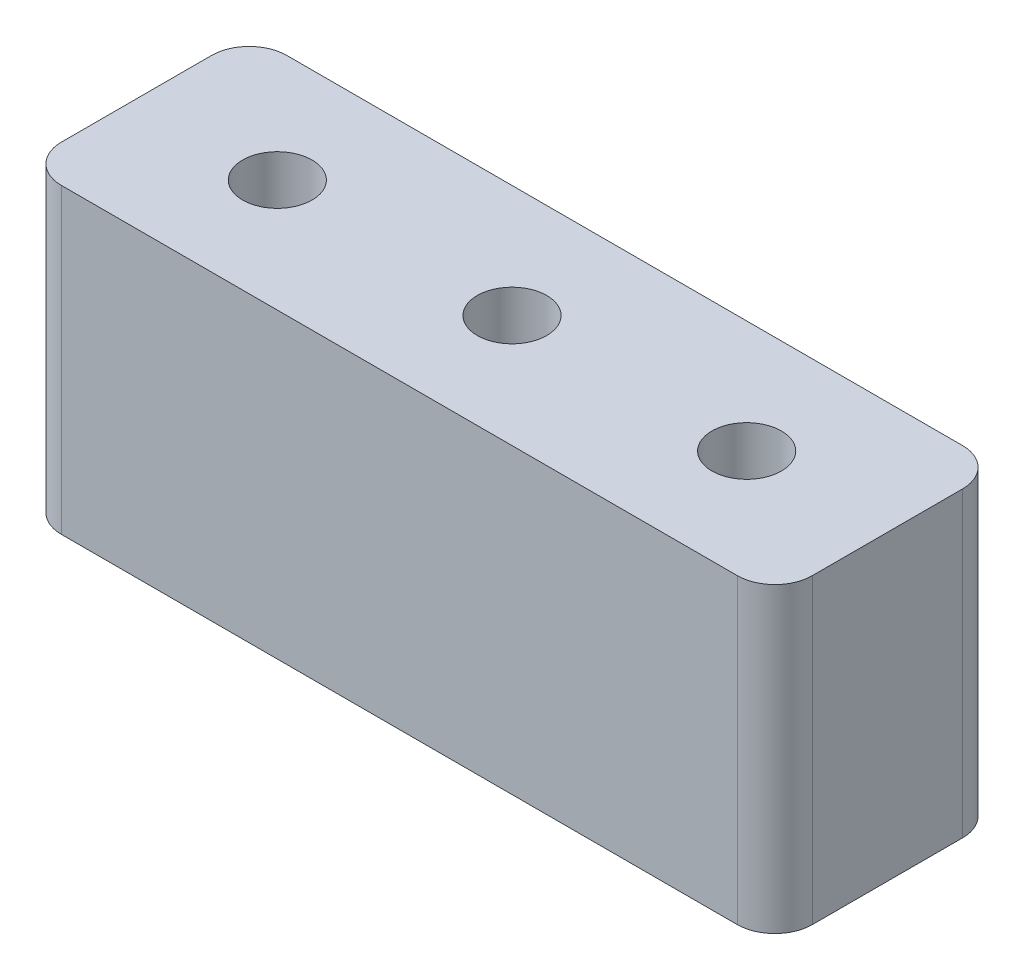
ISO-10303-21;
HEADER;
FILE_DESCRIPTION(('STEP AP214'),'2;1');
FILE_NAME('part.step','',(''),(''),'','','');
FILE_SCHEMA(('AUTOMOTIVE_DESIGN { 1 0 10303 214 1 1 1 1 }'));
ENDSEC;
DATA;
#1=APPLICATION_CONTEXT('core data for automotive mechanical design processes');
#2=APPLICATION_PROTOCOL_DEFINITION('international standard','automotive_design',2000,#1);
#3=PRODUCT_CONTEXT('',#1,'mechanical');
#4=PRODUCT('Part','Part','',(#3));
#5=PRODUCT_RELATED_PRODUCT_CATEGORY('part','',(#4));
#6=PRODUCT_DEFINITION_FORMATION('','',#4);
#7=PRODUCT_DEFINITION_CONTEXT('part definition',#1,'design');
#8=PRODUCT_DEFINITION('design','',#6,#7);
#9=PRODUCT_DEFINITION_SHAPE('','',#8);
#10=(LENGTH_UNIT() NAMED_UNIT(*) SI_UNIT(.MILLI.,.METRE.));
#11=(NAMED_UNIT(*) PLANE_ANGLE_UNIT() SI_UNIT($,.RADIAN.));
#12=(NAMED_UNIT(*) SI_UNIT($,.STERADIAN.) SOLID_ANGLE_UNIT());
#13=UNCERTAINTY_MEASURE_WITH_UNIT(LENGTH_MEASURE(1.E-05),#10,'distance_accuracy_value','');
#14=(GEOMETRIC_REPRESENTATION_CONTEXT(3) GLOBAL_UNCERTAINTY_ASSIGNED_CONTEXT((#13)) GLOBAL_UNIT_ASSIGNED_CONTEXT((#10,
#11,#12)) REPRESENTATION_CONTEXT('',''));
#15=CARTESIAN_POINT('',(0.,0.,0.));
#16=DIRECTION('',(0.,0.,1.));
#17=DIRECTION('',(1.,0.,0.));
#18=AXIS2_PLACEMENT_3D('',#15,#16,#17);
#19=CARTESIAN_POINT('',(0.,16.1,0.));
#20=DIRECTION('',(0.,1.,0.));
#21=DIRECTION('',(0.,0.,1.));
#22=AXIS2_PLACEMENT_3D('',#19,#20,#21);
#23=PLANE('',#22);
#24=CARTESIAN_POINT('',(0.,16.1,0.));
#25=DIRECTION('',(0.,1.,0.));
#26=DIRECTION('',(0.,0.,1.));
#27=AXIS2_PLACEMENT_3D('',#24,#25,#26);
#28=CIRCLE('',#27,1.85);
#29=CARTESIAN_POINT('',(0.,16.1,1.85));
#30=VERTEX_POINT('',#29);
#31=EDGE_CURVE('E193',#30,#30,#28,.T.);
#32=ORIENTED_EDGE('',*,*,#31,.F.);
#33=EDGE_LOOP('',(#32));
#34=FACE_BOUND('',#33,.T.);
#35=CARTESIAN_POINT('',(-12.5,16.1,0.));
#36=DIRECTION('',(0.,1.,0.));
#37=DIRECTION('',(0.,0.,1.));
#38=AXIS2_PLACEMENT_3D('',#35,#36,#37);
#39=CIRCLE('',#38,1.85);
#40=CARTESIAN_POINT('',(-12.5,16.1,1.85));
#41=VERTEX_POINT('',#40);
#42=EDGE_CURVE('E175',#41,#41,#39,.T.);
#43=ORIENTED_EDGE('',*,*,#42,.F.);
#44=EDGE_LOOP('',(#43));
#45=FACE_BOUND('',#44,.T.);
#46=DIRECTION('',(0.,0.,1.));
#47=VECTOR('',#46,1.);
#48=CARTESIAN_POINT('',(-20.,16.1,-6.));
#49=LINE('',#48,#47);
#50=CARTESIAN_POINT('',(-20.,16.1,-4.));
#51=VERTEX_POINT('',#50);
#52=CARTESIAN_POINT('',(-20.,16.1,4.));
#53=VERTEX_POINT('',#52);
#54=EDGE_CURVE('E179',#51,#53,#49,.T.);
#55=ORIENTED_EDGE('',*,*,#54,.T.);
#56=CARTESIAN_POINT('',(-18.,16.1,4.));
#57=DIRECTION('',(0.,1.,0.));
#58=DIRECTION('',(0.,0.,1.));
#59=AXIS2_PLACEMENT_3D('',#56,#57,#58);
#60=CIRCLE('',#59,2.);
#61=CARTESIAN_POINT('',(-18.,16.1,6.));
#62=VERTEX_POINT('',#61);
#63=EDGE_CURVE('E155',#53,#62,#60,.T.);
#64=ORIENTED_EDGE('',*,*,#63,.T.);
#65=DIRECTION('',(1.,0.,0.));
#66=VECTOR('',#65,1.);
#67=CARTESIAN_POINT('',(-20.,16.1,6.));
#68=LINE('',#67,#66);
#69=CARTESIAN_POINT('',(18.,16.1,6.));
#70=VERTEX_POINT('',#69);
#71=EDGE_CURVE('E126',#62,#70,#68,.T.);
#72=ORIENTED_EDGE('',*,*,#71,.T.);
#73=CARTESIAN_POINT('',(18.,16.1,4.));
#74=DIRECTION('',(0.,1.,0.));
#75=DIRECTION('',(0.,0.,1.));
#76=AXIS2_PLACEMENT_3D('',#73,#74,#75);
#77=CIRCLE('',#76,2.);
#78=CARTESIAN_POINT('',(20.,16.1,4.));
#79=VERTEX_POINT('',#78);
#80=EDGE_CURVE('E151',#70,#79,#77,.T.);
#81=ORIENTED_EDGE('',*,*,#80,.T.);
#82=DIRECTION('',(0.,0.,-1.));
#83=VECTOR('',#82,1.);
#84=CARTESIAN_POINT('',(20.,16.1,-6.));
#85=LINE('',#84,#83);
#86=CARTESIAN_POINT('',(20.,16.1,-4.));
#87=VERTEX_POINT('',#86);
#88=EDGE_CURVE('E134',#79,#87,#85,.T.);
#89=ORIENTED_EDGE('',*,*,#88,.T.);
#90=CARTESIAN_POINT('',(18.,16.1,-4.));
#91=DIRECTION('',(0.,1.,0.));
#92=DIRECTION('',(0.,0.,1.));
#93=AXIS2_PLACEMENT_3D('',#90,#91,#92);
#94=CIRCLE('',#93,2.);
#95=CARTESIAN_POINT('',(18.,16.1,-6.));
#96=VERTEX_POINT('',#95);
#97=EDGE_CURVE('E61',#87,#96,#94,.T.);
#98=ORIENTED_EDGE('',*,*,#97,.T.);
#99=DIRECTION('',(-1.,0.,0.));
#100=VECTOR('',#99,1.);
#101=CARTESIAN_POINT('',(-20.,16.1,-6.));
#102=LINE('',#101,#100);
#103=CARTESIAN_POINT('',(-18.,16.1,-6.));
#104=VERTEX_POINT('',#103);
#105=EDGE_CURVE('E137',#96,#104,#102,.T.);
#106=ORIENTED_EDGE('',*,*,#105,.T.);
#107=CARTESIAN_POINT('',(-18.,16.1,-4.));
#108=DIRECTION('',(0.,1.,0.));
#109=DIRECTION('',(0.,0.,1.));
#110=AXIS2_PLACEMENT_3D('',#107,#108,#109);
#111=CIRCLE('',#110,2.);
#112=EDGE_CURVE('E153',#104,#51,#111,.T.);
#113=ORIENTED_EDGE('',*,*,#112,.T.);
#114=EDGE_LOOP('',(#55,#64,#72,#81,#89,#98,#106,#113));
#115=FACE_BOUND('',#114,.T.);
#116=CARTESIAN_POINT('',(12.5,16.1,0.));
#117=DIRECTION('',(0.,1.,0.));
#118=DIRECTION('',(0.,0.,1.));
#119=AXIS2_PLACEMENT_3D('',#116,#117,#118);
#120=CIRCLE('',#119,1.85);
#121=CARTESIAN_POINT('',(12.5,16.1,1.85));
#122=VERTEX_POINT('',#121);
#123=EDGE_CURVE('E185',#122,#122,#120,.T.);
#124=ORIENTED_EDGE('',*,*,#123,.F.);
#125=EDGE_LOOP('',(#124));
#126=FACE_BOUND('',#125,.T.);
#127=ADVANCED_FACE('F38',(#34,#45,#115,#126),#23,.T.);
#128=CARTESIAN_POINT('',(0.,0.,0.));
#129=DIRECTION('',(0.,1.,0.));
#130=DIRECTION('',(0.,0.,1.));
#131=AXIS2_PLACEMENT_3D('',#128,#129,#130);
#132=PLANE('',#131);
#133=CARTESIAN_POINT('',(0.,0.,0.));
#134=DIRECTION('',(0.,1.,0.));
#135=DIRECTION('',(0.,0.,1.));
#136=AXIS2_PLACEMENT_3D('',#133,#134,#135);
#137=CIRCLE('',#136,1.85);
#138=CARTESIAN_POINT('',(0.,0.,1.85));
#139=VERTEX_POINT('',#138);
#140=EDGE_CURVE('E42',#139,#139,#137,.T.);
#141=ORIENTED_EDGE('',*,*,#140,.T.);
#142=EDGE_LOOP('',(#141));
#143=FACE_BOUND('',#142,.T.);
#144=DIRECTION('',(1.,0.,0.));
#145=VECTOR('',#144,1.);
#146=CARTESIAN_POINT('',(-20.,0.,6.));
#147=LINE('',#146,#145);
#148=CARTESIAN_POINT('',(-18.,0.,6.));
#149=VERTEX_POINT('',#148);
#150=CARTESIAN_POINT('',(18.,0.,6.));
#151=VERTEX_POINT('',#150);
#152=EDGE_CURVE('E123',#149,#151,#147,.T.);
#153=ORIENTED_EDGE('',*,*,#152,.F.);
#154=CARTESIAN_POINT('',(-18.,0.,4.));
#155=DIRECTION('',(0.,1.,0.));
#156=DIRECTION('',(0.,0.,1.));
#157=AXIS2_PLACEMENT_3D('',#154,#155,#156);
#158=CIRCLE('',#157,2.);
#159=CARTESIAN_POINT('',(-20.,0.,4.));
#160=VERTEX_POINT('',#159);
#161=EDGE_CURVE('E106',#149,#160,#158,.F.);
#162=ORIENTED_EDGE('',*,*,#161,.T.);
#163=DIRECTION('',(0.,0.,1.));
#164=VECTOR('',#163,1.);
#165=CARTESIAN_POINT('',(-20.,0.,-6.));
#166=LINE('',#165,#164);
#167=CARTESIAN_POINT('',(-20.,0.,-4.));
#168=VERTEX_POINT('',#167);
#169=EDGE_CURVE('E135',#168,#160,#166,.T.);
#170=ORIENTED_EDGE('',*,*,#169,.F.);
#171=CARTESIAN_POINT('',(-18.,0.,-4.));
#172=DIRECTION('',(0.,1.,0.));
#173=DIRECTION('',(0.,0.,1.));
#174=AXIS2_PLACEMENT_3D('',#171,#172,#173);
#175=CIRCLE('',#174,2.);
#176=CARTESIAN_POINT('',(-18.,0.,-6.));
#177=VERTEX_POINT('',#176);
#178=EDGE_CURVE('E117',#168,#177,#175,.F.);
#179=ORIENTED_EDGE('',*,*,#178,.T.);
#180=DIRECTION('',(-1.,0.,0.));
#181=VECTOR('',#180,1.);
#182=CARTESIAN_POINT('',(-20.,0.,-6.));
#183=LINE('',#182,#181);
#184=CARTESIAN_POINT('',(18.,0.,-6.));
#185=VERTEX_POINT('',#184);
#186=EDGE_CURVE('E139',#185,#177,#183,.T.);
#187=ORIENTED_EDGE('',*,*,#186,.F.);
#188=CARTESIAN_POINT('',(18.,0.,-4.));
#189=DIRECTION('',(0.,1.,0.));
#190=DIRECTION('',(0.,0.,1.));
#191=AXIS2_PLACEMENT_3D('',#188,#189,#190);
#192=CIRCLE('',#191,2.);
#193=CARTESIAN_POINT('',(20.,0.,-4.));
#194=VERTEX_POINT('',#193);
#195=EDGE_CURVE('E127',#185,#194,#192,.F.);
#196=ORIENTED_EDGE('',*,*,#195,.T.);
#197=DIRECTION('',(0.,0.,-1.));
#198=VECTOR('',#197,1.);
#199=CARTESIAN_POINT('',(20.,0.,-6.));
#200=LINE('',#199,#198);
#201=CARTESIAN_POINT('',(20.,0.,4.));
#202=VERTEX_POINT('',#201);
#203=EDGE_CURVE('E167',#202,#194,#200,.T.);
#204=ORIENTED_EDGE('',*,*,#203,.F.);
#205=CARTESIAN_POINT('',(18.,0.,4.));
#206=DIRECTION('',(0.,1.,0.));
#207=DIRECTION('',(0.,0.,1.));
#208=AXIS2_PLACEMENT_3D('',#205,#206,#207);
#209=CIRCLE('',#208,2.);
#210=EDGE_CURVE('E133',#202,#151,#209,.F.);
#211=ORIENTED_EDGE('',*,*,#210,.T.);
#212=EDGE_LOOP('',(#153,#162,#170,#179,#187,#196,#204,#211));
#213=FACE_BOUND('',#212,.T.);
#214=CARTESIAN_POINT('',(-12.5,0.,0.));
#215=DIRECTION('',(0.,1.,0.));
#216=DIRECTION('',(0.,0.,1.));
#217=AXIS2_PLACEMENT_3D('',#214,#215,#216);
#218=CIRCLE('',#217,1.85);
#219=CARTESIAN_POINT('',(-12.5,0.,1.85));
#220=VERTEX_POINT('',#219);
#221=EDGE_CURVE('E182',#220,#220,#218,.T.);
#222=ORIENTED_EDGE('',*,*,#221,.T.);
#223=EDGE_LOOP('',(#222));
#224=FACE_BOUND('',#223,.T.);
#225=CARTESIAN_POINT('',(12.5,0.,0.));
#226=DIRECTION('',(0.,1.,0.));
#227=DIRECTION('',(0.,0.,1.));
#228=AXIS2_PLACEMENT_3D('',#225,#226,#227);
#229=CIRCLE('',#228,1.85);
#230=CARTESIAN_POINT('',(12.5,0.,1.85));
#231=VERTEX_POINT('',#230);
#232=EDGE_CURVE('E188',#231,#231,#229,.T.);
#233=ORIENTED_EDGE('',*,*,#232,.T.);
#234=EDGE_LOOP('',(#233));
#235=FACE_BOUND('',#234,.T.);
#236=ADVANCED_FACE('F130',(#143,#213,#224,#235),#132,.F.);
#237=CARTESIAN_POINT('',(20.,16.1,-6.));
#238=DIRECTION('',(-1.,0.,0.));
#239=DIRECTION('',(0.,0.,1.));
#240=AXIS2_PLACEMENT_3D('',#237,#238,#239);
#241=PLANE('',#240);
#242=ORIENTED_EDGE('',*,*,#88,.F.);
#243=DIRECTION('',(0.,-1.,0.));
#244=VECTOR('',#243,1.);
#245=CARTESIAN_POINT('',(20.,16.1,4.));
#246=LINE('',#245,#244);
#247=EDGE_CURVE('E11',#79,#202,#246,.T.);
#248=ORIENTED_EDGE('',*,*,#247,.T.);
#249=ORIENTED_EDGE('',*,*,#203,.T.);
#250=DIRECTION('',(0.,-1.,0.));
#251=VECTOR('',#250,1.);
#252=CARTESIAN_POINT('',(20.,16.1,-4.));
#253=LINE('',#252,#251);
#254=EDGE_CURVE('E47',#194,#87,#253,.F.);
#255=ORIENTED_EDGE('',*,*,#254,.T.);
#256=EDGE_LOOP('',(#242,#248,#249,#255));
#257=FACE_BOUND('',#256,.T.);
#258=ADVANCED_FACE('F165',(#257),#241,.F.);
#259=CARTESIAN_POINT('',(-20.,16.1,-6.));
#260=DIRECTION('',(0.,0.,1.));
#261=DIRECTION('',(1.,0.,0.));
#262=AXIS2_PLACEMENT_3D('',#259,#260,#261);
#263=PLANE('',#262);
#264=ORIENTED_EDGE('',*,*,#186,.T.);
#265=DIRECTION('',(0.,-1.,0.));
#266=VECTOR('',#265,1.);
#267=CARTESIAN_POINT('',(-18.,16.1,-6.));
#268=LINE('',#267,#266);
#269=EDGE_CURVE('E54',#177,#104,#268,.F.);
#270=ORIENTED_EDGE('',*,*,#269,.T.);
#271=ORIENTED_EDGE('',*,*,#105,.F.);
#272=DIRECTION('',(0.,-1.,0.));
#273=VECTOR('',#272,1.);
#274=CARTESIAN_POINT('',(18.,16.1,-6.));
#275=LINE('',#274,#273);
#276=EDGE_CURVE('E157',#96,#185,#275,.T.);
#277=ORIENTED_EDGE('',*,*,#276,.T.);
#278=EDGE_LOOP('',(#264,#270,#271,#277));
#279=FACE_BOUND('',#278,.T.);
#280=ADVANCED_FACE('F174',(#279),#263,.F.);
#281=CARTESIAN_POINT('',(-20.,16.1,-6.));
#282=DIRECTION('',(1.,0.,0.));
#283=DIRECTION('',(0.,0.,-1.));
#284=AXIS2_PLACEMENT_3D('',#281,#282,#283);
#285=PLANE('',#284);
#286=ORIENTED_EDGE('',*,*,#169,.T.);
#287=DIRECTION('',(0.,-1.,0.));
#288=VECTOR('',#287,1.);
#289=CARTESIAN_POINT('',(-20.,16.1,4.));
#290=LINE('',#289,#288);
#291=EDGE_CURVE('E111',#160,#53,#290,.F.);
#292=ORIENTED_EDGE('',*,*,#291,.T.);
#293=ORIENTED_EDGE('',*,*,#54,.F.);
#294=DIRECTION('',(0.,-1.,0.));
#295=VECTOR('',#294,1.);
#296=CARTESIAN_POINT('',(-20.,16.1,-4.));
#297=LINE('',#296,#295);
#298=EDGE_CURVE('E116',#51,#168,#297,.T.);
#299=ORIENTED_EDGE('',*,*,#298,.T.);
#300=EDGE_LOOP('',(#286,#292,#293,#299));
#301=FACE_BOUND('',#300,.T.);
#302=ADVANCED_FACE('F222',(#301),#285,.F.);
#303=CARTESIAN_POINT('',(-20.,16.1,6.));
#304=DIRECTION('',(0.,0.,-1.));
#305=DIRECTION('',(-1.,0.,0.));
#306=AXIS2_PLACEMENT_3D('',#303,#304,#305);
#307=PLANE('',#306);
#308=ORIENTED_EDGE('',*,*,#71,.F.);
#309=DIRECTION('',(0.,-1.,0.));
#310=VECTOR('',#309,1.);
#311=CARTESIAN_POINT('',(-18.,16.1,6.));
#312=LINE('',#311,#310);
#313=EDGE_CURVE('E110',#62,#149,#312,.T.);
#314=ORIENTED_EDGE('',*,*,#313,.T.);
#315=ORIENTED_EDGE('',*,*,#152,.T.);
#316=DIRECTION('',(0.,-1.,0.));
#317=VECTOR('',#316,1.);
#318=CARTESIAN_POINT('',(18.,16.1,6.));
#319=LINE('',#318,#317);
#320=EDGE_CURVE('E128',#151,#70,#319,.F.);
#321=ORIENTED_EDGE('',*,*,#320,.T.);
#322=EDGE_LOOP('',(#308,#314,#315,#321));
#323=FACE_BOUND('',#322,.T.);
#324=ADVANCED_FACE('F122',(#323),#307,.F.);
#325=CARTESIAN_POINT('',(-12.5,16.1,0.));
#326=DIRECTION('',(0.,-1.,0.));
#327=DIRECTION('',(0.,0.,-1.));
#328=AXIS2_PLACEMENT_3D('',#325,#326,#327);
#329=CYLINDRICAL_SURFACE('',#328,1.85);
#330=ORIENTED_EDGE('',*,*,#42,.T.);
#331=EDGE_LOOP('',(#330));
#332=FACE_BOUND('',#331,.T.);
#333=ORIENTED_EDGE('',*,*,#221,.F.);
#334=EDGE_LOOP('',(#333));
#335=FACE_BOUND('',#334,.T.);
#336=ADVANCED_FACE('F218',(#332,#335),#329,.F.);
#337=CARTESIAN_POINT('',(12.5,16.1,0.));
#338=DIRECTION('',(0.,-1.,0.));
#339=DIRECTION('',(0.,0.,-1.));
#340=AXIS2_PLACEMENT_3D('',#337,#338,#339);
#341=CYLINDRICAL_SURFACE('',#340,1.85);
#342=ORIENTED_EDGE('',*,*,#123,.T.);
#343=EDGE_LOOP('',(#342));
#344=FACE_BOUND('',#343,.T.);
#345=ORIENTED_EDGE('',*,*,#232,.F.);
#346=EDGE_LOOP('',(#345));
#347=FACE_BOUND('',#346,.T.);
#348=ADVANCED_FACE('F233',(#344,#347),#341,.F.);
#349=CARTESIAN_POINT('',(-18.,16.1,4.));
#350=DIRECTION('',(0.,-1.,0.));
#351=DIRECTION('',(0.,0.,-1.));
#352=AXIS2_PLACEMENT_3D('',#349,#350,#351);
#353=CYLINDRICAL_SURFACE('',#352,2.);
#354=ORIENTED_EDGE('',*,*,#63,.F.);
#355=ORIENTED_EDGE('',*,*,#291,.F.);
#356=ORIENTED_EDGE('',*,*,#161,.F.);
#357=ORIENTED_EDGE('',*,*,#313,.F.);
#358=EDGE_LOOP('',(#354,#355,#356,#357));
#359=FACE_BOUND('',#358,.T.);
#360=ADVANCED_FACE('F109',(#359),#353,.T.);
#361=CARTESIAN_POINT('',(-18.,16.1,-4.));
#362=DIRECTION('',(0.,-1.,0.));
#363=DIRECTION('',(0.,0.,-1.));
#364=AXIS2_PLACEMENT_3D('',#361,#362,#363);
#365=CYLINDRICAL_SURFACE('',#364,2.);
#366=ORIENTED_EDGE('',*,*,#112,.F.);
#367=ORIENTED_EDGE('',*,*,#269,.F.);
#368=ORIENTED_EDGE('',*,*,#178,.F.);
#369=ORIENTED_EDGE('',*,*,#298,.F.);
#370=EDGE_LOOP('',(#366,#367,#368,#369));
#371=FACE_BOUND('',#370,.T.);
#372=ADVANCED_FACE('F232',(#371),#365,.T.);
#373=CARTESIAN_POINT('',(18.,16.1,4.));
#374=DIRECTION('',(0.,-1.,0.));
#375=DIRECTION('',(0.,0.,-1.));
#376=AXIS2_PLACEMENT_3D('',#373,#374,#375);
#377=CYLINDRICAL_SURFACE('',#376,2.);
#378=ORIENTED_EDGE('',*,*,#80,.F.);
#379=ORIENTED_EDGE('',*,*,#320,.F.);
#380=ORIENTED_EDGE('',*,*,#210,.F.);
#381=ORIENTED_EDGE('',*,*,#247,.F.);
#382=EDGE_LOOP('',(#378,#379,#380,#381));
#383=FACE_BOUND('',#382,.T.);
#384=ADVANCED_FACE('F207',(#383),#377,.T.);
#385=CARTESIAN_POINT('',(18.,16.1,-4.));
#386=DIRECTION('',(0.,-1.,0.));
#387=DIRECTION('',(0.,0.,-1.));
#388=AXIS2_PLACEMENT_3D('',#385,#386,#387);
#389=CYLINDRICAL_SURFACE('',#388,2.);
#390=ORIENTED_EDGE('',*,*,#97,.F.);
#391=ORIENTED_EDGE('',*,*,#254,.F.);
#392=ORIENTED_EDGE('',*,*,#195,.F.);
#393=ORIENTED_EDGE('',*,*,#276,.F.);
#394=EDGE_LOOP('',(#390,#391,#392,#393));
#395=FACE_BOUND('',#394,.T.);
#396=ADVANCED_FACE('F40',(#395),#389,.T.);
#397=CARTESIAN_POINT('',(0.,-3.9,0.));
#398=DIRECTION('',(0.,1.,0.));
#399=DIRECTION('',(0.,0.,1.));
#400=AXIS2_PLACEMENT_3D('',#397,#398,#399);
#401=CYLINDRICAL_SURFACE('',#400,1.85);
#402=ORIENTED_EDGE('',*,*,#31,.T.);
#403=EDGE_LOOP('',(#402));
#404=FACE_BOUND('',#403,.T.);
#405=ORIENTED_EDGE('',*,*,#140,.F.);
#406=EDGE_LOOP('',(#405));
#407=FACE_BOUND('',#406,.T.);
#408=ADVANCED_FACE('F201',(#404,#407),#401,.F.);
#409=CLOSED_SHELL('',(#127,#236,#258,#280,#302,#324,#336,#348,#360,#372,#384,#396,#408));
#410=MANIFOLD_SOLID_BREP('B2',#409);
#411=ADVANCED_BREP_SHAPE_REPRESENTATION('',(#18,#410),#14);
#412=SHAPE_DEFINITION_REPRESENTATION(#9,#411);
ENDSEC;
END-ISO-10303-21;
